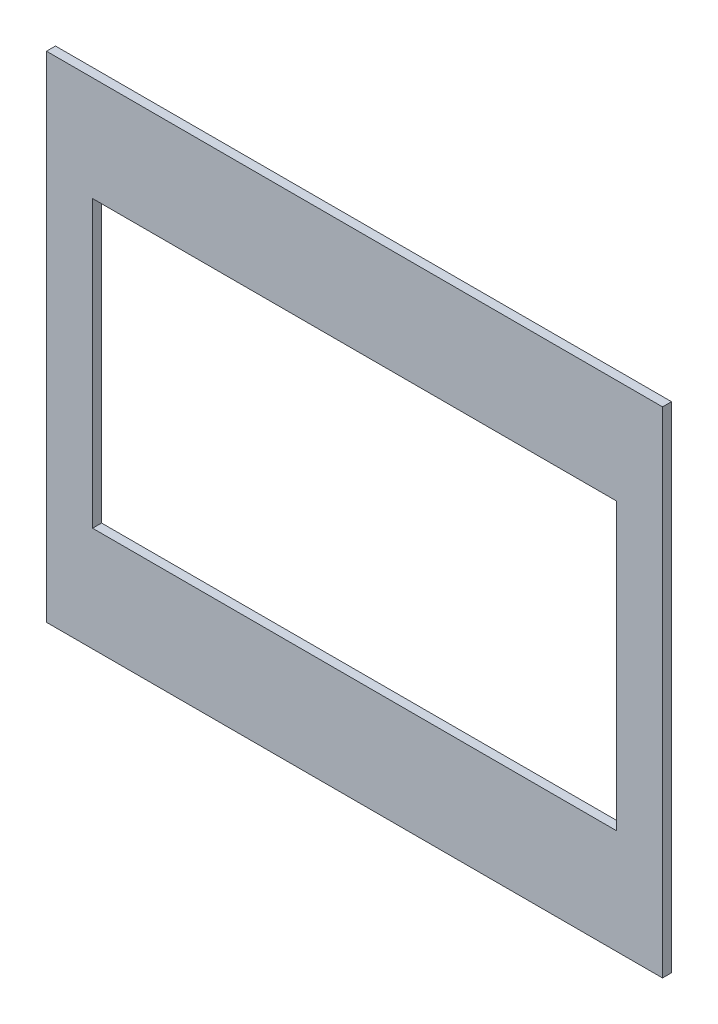
ISO-10303-21;
HEADER;
FILE_DESCRIPTION(('STEP AP214'),'2;1');
FILE_NAME('part.step','',(''),(''),'','','');
FILE_SCHEMA(('AUTOMOTIVE_DESIGN { 1 0 10303 214 1 1 1 1 }'));
ENDSEC;
DATA;
#1=APPLICATION_CONTEXT('core data for automotive mechanical design processes');
#2=APPLICATION_PROTOCOL_DEFINITION('international standard','automotive_design',2000,#1);
#3=PRODUCT_CONTEXT('',#1,'mechanical');
#4=PRODUCT('Part','Part','',(#3));
#5=PRODUCT_RELATED_PRODUCT_CATEGORY('part','',(#4));
#6=PRODUCT_DEFINITION_FORMATION('','',#4);
#7=PRODUCT_DEFINITION_CONTEXT('part definition',#1,'design');
#8=PRODUCT_DEFINITION('design','',#6,#7);
#9=PRODUCT_DEFINITION_SHAPE('','',#8);
#10=(LENGTH_UNIT() NAMED_UNIT(*) SI_UNIT(.MILLI.,.METRE.));
#11=(NAMED_UNIT(*) PLANE_ANGLE_UNIT() SI_UNIT($,.RADIAN.));
#12=(NAMED_UNIT(*) SI_UNIT($,.STERADIAN.) SOLID_ANGLE_UNIT());
#13=UNCERTAINTY_MEASURE_WITH_UNIT(LENGTH_MEASURE(1.E-05),#10,'distance_accuracy_value','');
#14=(GEOMETRIC_REPRESENTATION_CONTEXT(3) GLOBAL_UNCERTAINTY_ASSIGNED_CONTEXT((#13)) GLOBAL_UNIT_ASSIGNED_CONTEXT((#10,
#11,#12)) REPRESENTATION_CONTEXT('',''));
#15=CARTESIAN_POINT('',(0.,0.,0.));
#16=DIRECTION('',(0.,0.,1.));
#17=DIRECTION('',(1.,0.,0.));
#18=AXIS2_PLACEMENT_3D('',#15,#16,#17);
#19=CARTESIAN_POINT('',(0.,0.,2.));
#20=DIRECTION('',(0.,0.,-1.));
#21=DIRECTION('',(-1.,0.,0.));
#22=AXIS2_PLACEMENT_3D('',#19,#20,#21);
#23=PLANE('',#22);
#24=DIRECTION('',(0.,1.,0.));
#25=VECTOR('',#24,1.);
#26=CARTESIAN_POINT('',(68.5,-55.,2.));
#27=LINE('',#26,#25);
#28=CARTESIAN_POINT('',(68.5,-55.,2.));
#29=VERTEX_POINT('',#28);
#30=CARTESIAN_POINT('',(68.5,55.,2.));
#31=VERTEX_POINT('',#30);
#32=EDGE_CURVE('E153',#29,#31,#27,.T.);
#33=ORIENTED_EDGE('',*,*,#32,.T.);
#34=DIRECTION('',(-1.,0.,0.));
#35=VECTOR('',#34,1.);
#36=CARTESIAN_POINT('',(-68.5,55.,2.));
#37=LINE('',#36,#35);
#38=CARTESIAN_POINT('',(-68.5,55.,2.));
#39=VERTEX_POINT('',#38);
#40=EDGE_CURVE('E157',#31,#39,#37,.T.);
#41=ORIENTED_EDGE('',*,*,#40,.T.);
#42=DIRECTION('',(0.,-1.,0.));
#43=VECTOR('',#42,1.);
#44=CARTESIAN_POINT('',(-68.5,-55.,2.));
#45=LINE('',#44,#43);
#46=CARTESIAN_POINT('',(-68.5,-55.,2.));
#47=VERTEX_POINT('',#46);
#48=EDGE_CURVE('E161',#39,#47,#45,.T.);
#49=ORIENTED_EDGE('',*,*,#48,.T.);
#50=DIRECTION('',(1.,0.,0.));
#51=VECTOR('',#50,1.);
#52=CARTESIAN_POINT('',(-68.5,-55.,2.));
#53=LINE('',#52,#51);
#54=EDGE_CURVE('E164',#47,#29,#53,.T.);
#55=ORIENTED_EDGE('',*,*,#54,.T.);
#56=EDGE_LOOP('',(#33,#41,#49,#55));
#57=FACE_BOUND('',#56,.T.);
#58=DIRECTION('',(0.,1.,0.));
#59=VECTOR('',#58,1.);
#60=CARTESIAN_POINT('',(58.25,-31.75,2.));
#61=LINE('',#60,#59);
#62=CARTESIAN_POINT('',(58.25,-31.75,2.));
#63=VERTEX_POINT('',#62);
#64=CARTESIAN_POINT('',(58.25,31.75,2.));
#65=VERTEX_POINT('',#64);
#66=EDGE_CURVE('E105',#63,#65,#61,.T.);
#67=ORIENTED_EDGE('',*,*,#66,.F.);
#68=DIRECTION('',(1.,0.,0.));
#69=VECTOR('',#68,1.);
#70=CARTESIAN_POINT('',(-58.25,-31.75,2.));
#71=LINE('',#70,#69);
#72=CARTESIAN_POINT('',(-58.25,-31.75,2.));
#73=VERTEX_POINT('',#72);
#74=EDGE_CURVE('E131',#73,#63,#71,.T.);
#75=ORIENTED_EDGE('',*,*,#74,.F.);
#76=DIRECTION('',(0.,-1.,0.));
#77=VECTOR('',#76,1.);
#78=CARTESIAN_POINT('',(-58.25,-31.75,2.));
#79=LINE('',#78,#77);
#80=CARTESIAN_POINT('',(-58.25,31.75,2.));
#81=VERTEX_POINT('',#80);
#82=EDGE_CURVE('E127',#81,#73,#79,.T.);
#83=ORIENTED_EDGE('',*,*,#82,.F.);
#84=DIRECTION('',(-1.,0.,0.));
#85=VECTOR('',#84,1.);
#86=CARTESIAN_POINT('',(-58.25,31.75,2.));
#87=LINE('',#86,#85);
#88=EDGE_CURVE('E114',#65,#81,#87,.T.);
#89=ORIENTED_EDGE('',*,*,#88,.F.);
#90=EDGE_LOOP('',(#67,#75,#83,#89));
#91=FACE_BOUND('',#90,.T.);
#92=ADVANCED_FACE('F39',(#57,#91),#23,.F.);
#93=CARTESIAN_POINT('',(0.,0.,0.));
#94=DIRECTION('',(0.,0.,-1.));
#95=DIRECTION('',(-1.,0.,0.));
#96=AXIS2_PLACEMENT_3D('',#93,#94,#95);
#97=PLANE('',#96);
#98=DIRECTION('',(0.,1.,0.));
#99=VECTOR('',#98,1.);
#100=CARTESIAN_POINT('',(68.5,-55.,0.));
#101=LINE('',#100,#99);
#102=CARTESIAN_POINT('',(68.5,-55.,0.));
#103=VERTEX_POINT('',#102);
#104=CARTESIAN_POINT('',(68.5,55.,0.));
#105=VERTEX_POINT('',#104);
#106=EDGE_CURVE('E123',#103,#105,#101,.T.);
#107=ORIENTED_EDGE('',*,*,#106,.F.);
#108=DIRECTION('',(1.,0.,0.));
#109=VECTOR('',#108,1.);
#110=CARTESIAN_POINT('',(-68.5,-55.,0.));
#111=LINE('',#110,#109);
#112=CARTESIAN_POINT('',(-68.5,-55.,0.));
#113=VERTEX_POINT('',#112);
#114=EDGE_CURVE('E158',#113,#103,#111,.T.);
#115=ORIENTED_EDGE('',*,*,#114,.F.);
#116=DIRECTION('',(0.,-1.,0.));
#117=VECTOR('',#116,1.);
#118=CARTESIAN_POINT('',(-68.5,-55.,0.));
#119=LINE('',#118,#117);
#120=CARTESIAN_POINT('',(-68.5,55.,0.));
#121=VERTEX_POINT('',#120);
#122=EDGE_CURVE('E174',#121,#113,#119,.T.);
#123=ORIENTED_EDGE('',*,*,#122,.F.);
#124=DIRECTION('',(-1.,0.,0.));
#125=VECTOR('',#124,1.);
#126=CARTESIAN_POINT('',(-68.5,55.,0.));
#127=LINE('',#126,#125);
#128=EDGE_CURVE('E171',#105,#121,#127,.T.);
#129=ORIENTED_EDGE('',*,*,#128,.F.);
#130=EDGE_LOOP('',(#107,#115,#123,#129));
#131=FACE_BOUND('',#130,.T.);
#132=DIRECTION('',(1.,0.,0.));
#133=VECTOR('',#132,1.);
#134=CARTESIAN_POINT('',(-58.25,-31.75,0.));
#135=LINE('',#134,#133);
#136=CARTESIAN_POINT('',(-58.25,-31.75,0.));
#137=VERTEX_POINT('',#136);
#138=CARTESIAN_POINT('',(58.25,-31.75,0.));
#139=VERTEX_POINT('',#138);
#140=EDGE_CURVE('E115',#137,#139,#135,.T.);
#141=ORIENTED_EDGE('',*,*,#140,.T.);
#142=DIRECTION('',(0.,1.,0.));
#143=VECTOR('',#142,1.);
#144=CARTESIAN_POINT('',(58.25,-31.75,0.));
#145=LINE('',#144,#143);
#146=CARTESIAN_POINT('',(58.25,31.75,0.));
#147=VERTEX_POINT('',#146);
#148=EDGE_CURVE('E63',#139,#147,#145,.T.);
#149=ORIENTED_EDGE('',*,*,#148,.T.);
#150=DIRECTION('',(-1.,0.,0.));
#151=VECTOR('',#150,1.);
#152=CARTESIAN_POINT('',(-58.25,31.75,0.));
#153=LINE('',#152,#151);
#154=CARTESIAN_POINT('',(-58.25,31.75,0.));
#155=VERTEX_POINT('',#154);
#156=EDGE_CURVE('E121',#147,#155,#153,.T.);
#157=ORIENTED_EDGE('',*,*,#156,.T.);
#158=DIRECTION('',(0.,-1.,0.));
#159=VECTOR('',#158,1.);
#160=CARTESIAN_POINT('',(-58.25,-31.75,0.));
#161=LINE('',#160,#159);
#162=EDGE_CURVE('E140',#155,#137,#161,.T.);
#163=ORIENTED_EDGE('',*,*,#162,.T.);
#164=EDGE_LOOP('',(#141,#149,#157,#163));
#165=FACE_BOUND('',#164,.T.);
#166=ADVANCED_FACE('F197',(#131,#165),#97,.T.);
#167=CARTESIAN_POINT('',(68.5,-55.,2.));
#168=DIRECTION('',(-1.,0.,0.));
#169=DIRECTION('',(0.,0.,1.));
#170=AXIS2_PLACEMENT_3D('',#167,#168,#169);
#171=PLANE('',#170);
#172=ORIENTED_EDGE('',*,*,#106,.T.);
#173=DIRECTION('',(0.,0.,-1.));
#174=VECTOR('',#173,1.);
#175=CARTESIAN_POINT('',(68.5,55.,2.));
#176=LINE('',#175,#174);
#177=EDGE_CURVE('E11',#31,#105,#176,.T.);
#178=ORIENTED_EDGE('',*,*,#177,.F.);
#179=ORIENTED_EDGE('',*,*,#32,.F.);
#180=DIRECTION('',(0.,0.,-1.));
#181=VECTOR('',#180,1.);
#182=CARTESIAN_POINT('',(68.5,-55.,2.));
#183=LINE('',#182,#181);
#184=EDGE_CURVE('E167',#29,#103,#183,.T.);
#185=ORIENTED_EDGE('',*,*,#184,.T.);
#186=EDGE_LOOP('',(#172,#178,#179,#185));
#187=FACE_BOUND('',#186,.T.);
#188=ADVANCED_FACE('F41',(#187),#171,.F.);
#189=CARTESIAN_POINT('',(-68.5,55.,2.));
#190=DIRECTION('',(0.,-1.,0.));
#191=DIRECTION('',(0.,0.,-1.));
#192=AXIS2_PLACEMENT_3D('',#189,#190,#191);
#193=PLANE('',#192);
#194=ORIENTED_EDGE('',*,*,#128,.T.);
#195=DIRECTION('',(0.,0.,-1.));
#196=VECTOR('',#195,1.);
#197=CARTESIAN_POINT('',(-68.5,55.,2.));
#198=LINE('',#197,#196);
#199=EDGE_CURVE('E48',#39,#121,#198,.T.);
#200=ORIENTED_EDGE('',*,*,#199,.F.);
#201=ORIENTED_EDGE('',*,*,#40,.F.);
#202=ORIENTED_EDGE('',*,*,#177,.T.);
#203=EDGE_LOOP('',(#194,#200,#201,#202));
#204=FACE_BOUND('',#203,.T.);
#205=ADVANCED_FACE('F207',(#204),#193,.F.);
#206=CARTESIAN_POINT('',(-68.5,-55.,2.));
#207=DIRECTION('',(1.,0.,0.));
#208=DIRECTION('',(0.,0.,-1.));
#209=AXIS2_PLACEMENT_3D('',#206,#207,#208);
#210=PLANE('',#209);
#211=ORIENTED_EDGE('',*,*,#122,.T.);
#212=DIRECTION('',(0.,0.,-1.));
#213=VECTOR('',#212,1.);
#214=CARTESIAN_POINT('',(-68.5,-55.,2.));
#215=LINE('',#214,#213);
#216=EDGE_CURVE('E182',#47,#113,#215,.T.);
#217=ORIENTED_EDGE('',*,*,#216,.F.);
#218=ORIENTED_EDGE('',*,*,#48,.F.);
#219=ORIENTED_EDGE('',*,*,#199,.T.);
#220=EDGE_LOOP('',(#211,#217,#218,#219));
#221=FACE_BOUND('',#220,.T.);
#222=ADVANCED_FACE('F191',(#221),#210,.F.);
#223=CARTESIAN_POINT('',(-68.5,-55.,2.));
#224=DIRECTION('',(0.,1.,0.));
#225=DIRECTION('',(0.,0.,1.));
#226=AXIS2_PLACEMENT_3D('',#223,#224,#225);
#227=PLANE('',#226);
#228=ORIENTED_EDGE('',*,*,#114,.T.);
#229=ORIENTED_EDGE('',*,*,#184,.F.);
#230=ORIENTED_EDGE('',*,*,#54,.F.);
#231=ORIENTED_EDGE('',*,*,#216,.T.);
#232=EDGE_LOOP('',(#228,#229,#230,#231));
#233=FACE_BOUND('',#232,.T.);
#234=ADVANCED_FACE('F201',(#233),#227,.F.);
#235=CARTESIAN_POINT('',(58.25,-31.75,2.));
#236=DIRECTION('',(-1.,0.,0.));
#237=DIRECTION('',(0.,0.,1.));
#238=AXIS2_PLACEMENT_3D('',#235,#236,#237);
#239=PLANE('',#238);
#240=ORIENTED_EDGE('',*,*,#148,.F.);
#241=DIRECTION('',(0.,0.,-1.));
#242=VECTOR('',#241,1.);
#243=CARTESIAN_POINT('',(58.25,-31.75,2.));
#244=LINE('',#243,#242);
#245=EDGE_CURVE('E109',#63,#139,#244,.T.);
#246=ORIENTED_EDGE('',*,*,#245,.F.);
#247=ORIENTED_EDGE('',*,*,#66,.T.);
#248=DIRECTION('',(0.,0.,-1.));
#249=VECTOR('',#248,1.);
#250=CARTESIAN_POINT('',(58.25,31.75,2.));
#251=LINE('',#250,#249);
#252=EDGE_CURVE('E108',#65,#147,#251,.T.);
#253=ORIENTED_EDGE('',*,*,#252,.T.);
#254=EDGE_LOOP('',(#240,#246,#247,#253));
#255=FACE_BOUND('',#254,.T.);
#256=ADVANCED_FACE('F107',(#255),#239,.T.);
#257=CARTESIAN_POINT('',(-58.25,31.75,2.));
#258=DIRECTION('',(0.,-1.,0.));
#259=DIRECTION('',(0.,0.,-1.));
#260=AXIS2_PLACEMENT_3D('',#257,#258,#259);
#261=PLANE('',#260);
#262=ORIENTED_EDGE('',*,*,#156,.F.);
#263=ORIENTED_EDGE('',*,*,#252,.F.);
#264=ORIENTED_EDGE('',*,*,#88,.T.);
#265=DIRECTION('',(0.,0.,-1.));
#266=VECTOR('',#265,1.);
#267=CARTESIAN_POINT('',(-58.25,31.75,2.));
#268=LINE('',#267,#266);
#269=EDGE_CURVE('E124',#81,#155,#268,.T.);
#270=ORIENTED_EDGE('',*,*,#269,.T.);
#271=EDGE_LOOP('',(#262,#263,#264,#270));
#272=FACE_BOUND('',#271,.T.);
#273=ADVANCED_FACE('F118',(#272),#261,.T.);
#274=CARTESIAN_POINT('',(-58.25,-31.75,2.));
#275=DIRECTION('',(1.,0.,0.));
#276=DIRECTION('',(0.,0.,-1.));
#277=AXIS2_PLACEMENT_3D('',#274,#275,#276);
#278=PLANE('',#277);
#279=ORIENTED_EDGE('',*,*,#162,.F.);
#280=ORIENTED_EDGE('',*,*,#269,.F.);
#281=ORIENTED_EDGE('',*,*,#82,.T.);
#282=DIRECTION('',(0.,0.,-1.));
#283=VECTOR('',#282,1.);
#284=CARTESIAN_POINT('',(-58.25,-31.75,2.));
#285=LINE('',#284,#283);
#286=EDGE_CURVE('E55',#73,#137,#285,.T.);
#287=ORIENTED_EDGE('',*,*,#286,.T.);
#288=EDGE_LOOP('',(#279,#280,#281,#287));
#289=FACE_BOUND('',#288,.T.);
#290=ADVANCED_FACE('F230',(#289),#278,.T.);
#291=CARTESIAN_POINT('',(-58.25,-31.75,2.));
#292=DIRECTION('',(0.,1.,0.));
#293=DIRECTION('',(0.,0.,1.));
#294=AXIS2_PLACEMENT_3D('',#291,#292,#293);
#295=PLANE('',#294);
#296=ORIENTED_EDGE('',*,*,#140,.F.);
#297=ORIENTED_EDGE('',*,*,#286,.F.);
#298=ORIENTED_EDGE('',*,*,#74,.T.);
#299=ORIENTED_EDGE('',*,*,#245,.T.);
#300=EDGE_LOOP('',(#296,#297,#298,#299));
#301=FACE_BOUND('',#300,.T.);
#302=ADVANCED_FACE('F234',(#301),#295,.T.);
#303=CLOSED_SHELL('',(#92,#166,#188,#205,#222,#234,#256,#273,#290,#302));
#304=MANIFOLD_SOLID_BREP('B2',#303);
#305=ADVANCED_BREP_SHAPE_REPRESENTATION('',(#18,#304),#14);
#306=SHAPE_DEFINITION_REPRESENTATION(#9,#305);
ENDSEC;
END-ISO-10303-21;
